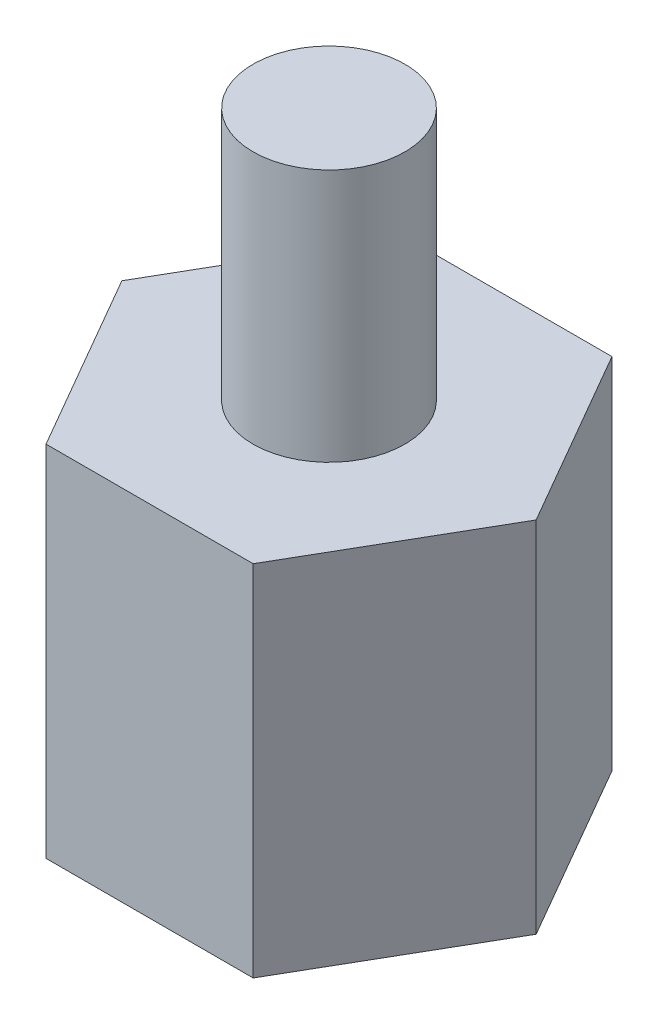
ISO-10303-21;
HEADER;
FILE_DESCRIPTION(('STEP AP214'),'2;1');
FILE_NAME('part.step','',(''),(''),'','','');
FILE_SCHEMA(('AUTOMOTIVE_DESIGN { 1 0 10303 214 1 1 1 1 }'));
ENDSEC;
DATA;
#1=APPLICATION_CONTEXT('core data for automotive mechanical design processes');
#2=APPLICATION_PROTOCOL_DEFINITION('international standard','automotive_design',2000,#1);
#3=PRODUCT_CONTEXT('',#1,'mechanical');
#4=PRODUCT('Part','Part','',(#3));
#5=PRODUCT_RELATED_PRODUCT_CATEGORY('part','',(#4));
#6=PRODUCT_DEFINITION_FORMATION('','',#4);
#7=PRODUCT_DEFINITION_CONTEXT('part definition',#1,'design');
#8=PRODUCT_DEFINITION('design','',#6,#7);
#9=PRODUCT_DEFINITION_SHAPE('','',#8);
#10=(LENGTH_UNIT() NAMED_UNIT(*) SI_UNIT(.MILLI.,.METRE.));
#11=(NAMED_UNIT(*) PLANE_ANGLE_UNIT() SI_UNIT($,.RADIAN.));
#12=(NAMED_UNIT(*) SI_UNIT($,.STERADIAN.) SOLID_ANGLE_UNIT());
#13=UNCERTAINTY_MEASURE_WITH_UNIT(LENGTH_MEASURE(1.E-05),#10,'distance_accuracy_value','');
#14=(GEOMETRIC_REPRESENTATION_CONTEXT(3) GLOBAL_UNCERTAINTY_ASSIGNED_CONTEXT((#13)) GLOBAL_UNIT_ASSIGNED_CONTEXT((#10,
#11,#12)) REPRESENTATION_CONTEXT('',''));
#15=CARTESIAN_POINT('',(0.,0.,0.));
#16=DIRECTION('',(0.,0.,1.));
#17=DIRECTION('',(1.,0.,0.));
#18=AXIS2_PLACEMENT_3D('',#15,#16,#17);
#19=CARTESIAN_POINT('',(3.63684481567929,6.2992,0.));
#20=DIRECTION('',(0.,1.,0.));
#21=DIRECTION('',(0.,0.,1.));
#22=AXIS2_PLACEMENT_3D('',#19,#20,#21);
#23=PLANE('',#22);
#24=DIRECTION('',(0.5,0.,-0.866025403784439));
#25=VECTOR('',#24,1.);
#26=CARTESIAN_POINT('',(1.81842240783965,6.2992,3.1496));
#27=LINE('',#26,#25);
#28=CARTESIAN_POINT('',(1.81842240783965,6.2992,3.1496));
#29=VERTEX_POINT('',#28);
#30=CARTESIAN_POINT('',(3.63684481567929,6.2992,0.));
#31=VERTEX_POINT('',#30);
#32=EDGE_CURVE('E129',#29,#31,#27,.T.);
#33=ORIENTED_EDGE('',*,*,#32,.T.);
#34=DIRECTION('',(-0.500000000000001,0.,-0.866025403784438));
#35=VECTOR('',#34,1.);
#36=CARTESIAN_POINT('',(3.63684481567929,6.2992,0.));
#37=LINE('',#36,#35);
#38=CARTESIAN_POINT('',(1.81842240783963,6.2992,-3.14960000000001));
#39=VERTEX_POINT('',#38);
#40=EDGE_CURVE('E87',#31,#39,#37,.T.);
#41=ORIENTED_EDGE('',*,*,#40,.T.);
#42=DIRECTION('',(-1.,0.,0.));
#43=VECTOR('',#42,1.);
#44=CARTESIAN_POINT('',(1.81842240783963,6.2992,-3.14960000000001));
#45=LINE('',#44,#43);
#46=CARTESIAN_POINT('',(-1.81842240783964,6.2992,-3.14960000000001));
#47=VERTEX_POINT('',#46);
#48=EDGE_CURVE('E100',#39,#47,#45,.T.);
#49=ORIENTED_EDGE('',*,*,#48,.T.);
#50=DIRECTION('',(-0.499999999999999,0.,0.866025403784439));
#51=VECTOR('',#50,1.);
#52=CARTESIAN_POINT('',(-1.81842240783964,6.2992,-3.14960000000001));
#53=LINE('',#52,#51);
#54=CARTESIAN_POINT('',(-3.63684481567929,6.2992,0.));
#55=VERTEX_POINT('',#54);
#56=EDGE_CURVE('E94',#47,#55,#53,.T.);
#57=ORIENTED_EDGE('',*,*,#56,.T.);
#58=DIRECTION('',(0.5,0.,0.866025403784439));
#59=VECTOR('',#58,1.);
#60=CARTESIAN_POINT('',(-3.63684481567929,6.2992,0.));
#61=LINE('',#60,#59);
#62=CARTESIAN_POINT('',(-1.81842240783965,6.2992,3.1496));
#63=VERTEX_POINT('',#62);
#64=EDGE_CURVE('E98',#55,#63,#61,.T.);
#65=ORIENTED_EDGE('',*,*,#64,.T.);
#66=DIRECTION('',(1.,0.,0.));
#67=VECTOR('',#66,1.);
#68=CARTESIAN_POINT('',(-1.81842240783965,6.2992,3.1496));
#69=LINE('',#68,#67);
#70=EDGE_CURVE('E50',#63,#29,#69,.T.);
#71=ORIENTED_EDGE('',*,*,#70,.T.);
#72=EDGE_LOOP('',(#33,#41,#49,#57,#65,#71));
#73=FACE_BOUND('',#72,.T.);
#74=CARTESIAN_POINT('',(0.,6.2992,0.));
#75=DIRECTION('',(0.,1.,0.));
#76=DIRECTION('',(0.,0.,1.));
#77=AXIS2_PLACEMENT_3D('',#74,#75,#76);
#78=CIRCLE('',#77,1.3335);
#79=CARTESIAN_POINT('',(0.,6.2992,1.3335));
#80=VERTEX_POINT('',#79);
#81=EDGE_CURVE('E180',#80,#80,#78,.T.);
#82=ORIENTED_EDGE('',*,*,#81,.F.);
#83=EDGE_LOOP('',(#82));
#84=FACE_BOUND('',#83,.T.);
#85=ADVANCED_FACE('F33',(#73,#84),#23,.T.);
#86=CARTESIAN_POINT('',(1.81842240783965,6.2992,3.1496));
#87=DIRECTION('',(-0.866025403784439,0.,-0.5));
#88=DIRECTION('',(-0.5,0.,0.866025403784439));
#89=AXIS2_PLACEMENT_3D('',#86,#87,#88);
#90=PLANE('',#89);
#91=DIRECTION('',(0.5,0.,-0.866025403784439));
#92=VECTOR('',#91,1.);
#93=CARTESIAN_POINT('',(1.81842240783965,0.,3.1496));
#94=LINE('',#93,#92);
#95=CARTESIAN_POINT('',(1.81842240783965,0.,3.1496));
#96=VERTEX_POINT('',#95);
#97=CARTESIAN_POINT('',(3.63684481567929,0.,0.));
#98=VERTEX_POINT('',#97);
#99=EDGE_CURVE('E118',#96,#98,#94,.T.);
#100=ORIENTED_EDGE('',*,*,#99,.T.);
#101=DIRECTION('',(0.,-1.,0.));
#102=VECTOR('',#101,1.);
#103=CARTESIAN_POINT('',(3.63684481567929,6.2992,0.));
#104=LINE('',#103,#102);
#105=EDGE_CURVE('E11',#31,#98,#104,.T.);
#106=ORIENTED_EDGE('',*,*,#105,.F.);
#107=ORIENTED_EDGE('',*,*,#32,.F.);
#108=DIRECTION('',(0.,-1.,0.));
#109=VECTOR('',#108,1.);
#110=CARTESIAN_POINT('',(1.81842240783965,6.2992,3.1496));
#111=LINE('',#110,#109);
#112=EDGE_CURVE('E114',#29,#96,#111,.T.);
#113=ORIENTED_EDGE('',*,*,#112,.T.);
#114=EDGE_LOOP('',(#100,#106,#107,#113));
#115=FACE_BOUND('',#114,.T.);
#116=ADVANCED_FACE('F35',(#115),#90,.F.);
#117=CARTESIAN_POINT('',(3.63684481567929,6.2992,0.));
#118=DIRECTION('',(-0.866025403784438,0.,0.500000000000001));
#119=DIRECTION('',(0.500000000000001,0.,0.866025403784438));
#120=AXIS2_PLACEMENT_3D('',#117,#118,#119);
#121=PLANE('',#120);
#122=DIRECTION('',(-0.500000000000001,0.,-0.866025403784438));
#123=VECTOR('',#122,1.);
#124=CARTESIAN_POINT('',(3.63684481567929,0.,0.));
#125=LINE('',#124,#123);
#126=CARTESIAN_POINT('',(1.81842240783963,0.,-3.14960000000001));
#127=VERTEX_POINT('',#126);
#128=EDGE_CURVE('E121',#98,#127,#125,.T.);
#129=ORIENTED_EDGE('',*,*,#128,.T.);
#130=DIRECTION('',(0.,-1.,0.));
#131=VECTOR('',#130,1.);
#132=CARTESIAN_POINT('',(1.81842240783963,6.2992,-3.14960000000001));
#133=LINE('',#132,#131);
#134=EDGE_CURVE('E42',#39,#127,#133,.T.);
#135=ORIENTED_EDGE('',*,*,#134,.F.);
#136=ORIENTED_EDGE('',*,*,#40,.F.);
#137=ORIENTED_EDGE('',*,*,#105,.T.);
#138=EDGE_LOOP('',(#129,#135,#136,#137));
#139=FACE_BOUND('',#138,.T.);
#140=ADVANCED_FACE('F159',(#139),#121,.F.);
#141=CARTESIAN_POINT('',(1.81842240783963,6.2992,-3.14960000000001));
#142=DIRECTION('',(0.,0.,1.));
#143=DIRECTION('',(1.,0.,0.));
#144=AXIS2_PLACEMENT_3D('',#141,#142,#143);
#145=PLANE('',#144);
#146=DIRECTION('',(-1.,0.,0.));
#147=VECTOR('',#146,1.);
#148=CARTESIAN_POINT('',(1.81842240783963,0.,-3.14960000000001));
#149=LINE('',#148,#147);
#150=CARTESIAN_POINT('',(-1.81842240783964,0.,-3.14960000000001));
#151=VERTEX_POINT('',#150);
#152=EDGE_CURVE('E124',#127,#151,#149,.T.);
#153=ORIENTED_EDGE('',*,*,#152,.T.);
#154=DIRECTION('',(0.,-1.,0.));
#155=VECTOR('',#154,1.);
#156=CARTESIAN_POINT('',(-1.81842240783964,6.2992,-3.14960000000001));
#157=LINE('',#156,#155);
#158=EDGE_CURVE('E109',#47,#151,#157,.T.);
#159=ORIENTED_EDGE('',*,*,#158,.F.);
#160=ORIENTED_EDGE('',*,*,#48,.F.);
#161=ORIENTED_EDGE('',*,*,#134,.T.);
#162=EDGE_LOOP('',(#153,#159,#160,#161));
#163=FACE_BOUND('',#162,.T.);
#164=ADVANCED_FACE('F135',(#163),#145,.F.);
#165=CARTESIAN_POINT('',(-1.81842240783964,6.2992,-3.14960000000001));
#166=DIRECTION('',(0.866025403784439,0.,0.499999999999999));
#167=DIRECTION('',(0.499999999999999,0.,-0.866025403784439));
#168=AXIS2_PLACEMENT_3D('',#165,#166,#167);
#169=PLANE('',#168);
#170=DIRECTION('',(-0.499999999999999,0.,0.866025403784439));
#171=VECTOR('',#170,1.);
#172=CARTESIAN_POINT('',(-1.81842240783964,0.,-3.14960000000001));
#173=LINE('',#172,#171);
#174=CARTESIAN_POINT('',(-3.63684481567929,0.,0.));
#175=VERTEX_POINT('',#174);
#176=EDGE_CURVE('E108',#151,#175,#173,.T.);
#177=ORIENTED_EDGE('',*,*,#176,.T.);
#178=DIRECTION('',(0.,-1.,0.));
#179=VECTOR('',#178,1.);
#180=CARTESIAN_POINT('',(-3.63684481567929,6.2992,0.));
#181=LINE('',#180,#179);
#182=EDGE_CURVE('E105',#55,#175,#181,.T.);
#183=ORIENTED_EDGE('',*,*,#182,.F.);
#184=ORIENTED_EDGE('',*,*,#56,.F.);
#185=ORIENTED_EDGE('',*,*,#158,.T.);
#186=EDGE_LOOP('',(#177,#183,#184,#185));
#187=FACE_BOUND('',#186,.T.);
#188=ADVANCED_FACE('F106',(#187),#169,.F.);
#189=CARTESIAN_POINT('',(-3.63684481567929,6.2992,0.));
#190=DIRECTION('',(0.866025403784439,0.,-0.5));
#191=DIRECTION('',(-0.5,0.,-0.866025403784439));
#192=AXIS2_PLACEMENT_3D('',#189,#190,#191);
#193=PLANE('',#192);
#194=DIRECTION('',(0.5,0.,0.866025403784439));
#195=VECTOR('',#194,1.);
#196=CARTESIAN_POINT('',(-3.63684481567929,0.,0.));
#197=LINE('',#196,#195);
#198=CARTESIAN_POINT('',(-1.81842240783965,0.,3.1496));
#199=VERTEX_POINT('',#198);
#200=EDGE_CURVE('E73',#175,#199,#197,.T.);
#201=ORIENTED_EDGE('',*,*,#200,.T.);
#202=DIRECTION('',(0.,-1.,0.));
#203=VECTOR('',#202,1.);
#204=CARTESIAN_POINT('',(-1.81842240783965,6.2992,3.1496));
#205=LINE('',#204,#203);
#206=EDGE_CURVE('E110',#63,#199,#205,.T.);
#207=ORIENTED_EDGE('',*,*,#206,.F.);
#208=ORIENTED_EDGE('',*,*,#64,.F.);
#209=ORIENTED_EDGE('',*,*,#182,.T.);
#210=EDGE_LOOP('',(#201,#207,#208,#209));
#211=FACE_BOUND('',#210,.T.);
#212=ADVANCED_FACE('F112',(#211),#193,.F.);
#213=CARTESIAN_POINT('',(-1.81842240783965,6.2992,3.1496));
#214=DIRECTION('',(0.,0.,-1.));
#215=DIRECTION('',(-1.,0.,0.));
#216=AXIS2_PLACEMENT_3D('',#213,#214,#215);
#217=PLANE('',#216);
#218=DIRECTION('',(1.,0.,0.));
#219=VECTOR('',#218,1.);
#220=CARTESIAN_POINT('',(-1.81842240783965,0.,3.1496));
#221=LINE('',#220,#219);
#222=EDGE_CURVE('E79',#199,#96,#221,.T.);
#223=ORIENTED_EDGE('',*,*,#222,.T.);
#224=ORIENTED_EDGE('',*,*,#112,.F.);
#225=ORIENTED_EDGE('',*,*,#70,.F.);
#226=ORIENTED_EDGE('',*,*,#206,.T.);
#227=EDGE_LOOP('',(#223,#224,#225,#226));
#228=FACE_BOUND('',#227,.T.);
#229=ADVANCED_FACE('F142',(#228),#217,.F.);
#230=CARTESIAN_POINT('',(3.63684481567929,0.,0.));
#231=DIRECTION('',(0.,1.,0.));
#232=DIRECTION('',(0.,0.,1.));
#233=AXIS2_PLACEMENT_3D('',#230,#231,#232);
#234=PLANE('',#233);
#235=CARTESIAN_POINT('',(0.,0.,0.));
#236=DIRECTION('',(0.,-1.,0.));
#237=DIRECTION('',(0.,0.,-1.));
#238=AXIS2_PLACEMENT_3D('',#235,#236,#237);
#239=CIRCLE('',#238,1.27);
#240=CARTESIAN_POINT('',(0.,0.,-1.27));
#241=VERTEX_POINT('',#240);
#242=EDGE_CURVE('E181',#241,#241,#239,.T.);
#243=ORIENTED_EDGE('',*,*,#242,.F.);
#244=EDGE_LOOP('',(#243));
#245=FACE_BOUND('',#244,.T.);
#246=ORIENTED_EDGE('',*,*,#99,.F.);
#247=ORIENTED_EDGE('',*,*,#222,.F.);
#248=ORIENTED_EDGE('',*,*,#200,.F.);
#249=ORIENTED_EDGE('',*,*,#176,.F.);
#250=ORIENTED_EDGE('',*,*,#152,.F.);
#251=ORIENTED_EDGE('',*,*,#128,.F.);
#252=EDGE_LOOP('',(#246,#247,#248,#249,#250,#251));
#253=FACE_BOUND('',#252,.T.);
#254=ADVANCED_FACE('F138',(#245,#253),#234,.F.);
#255=CARTESIAN_POINT('',(0.,10.7442,0.));
#256=DIRECTION('',(0.,-1.,0.));
#257=DIRECTION('',(0.,0.,-1.));
#258=AXIS2_PLACEMENT_3D('',#255,#256,#257);
#259=CYLINDRICAL_SURFACE('',#258,1.3335);
#260=CARTESIAN_POINT('',(0.,10.7442,0.));
#261=DIRECTION('',(0.,1.,0.));
#262=DIRECTION('',(0.,0.,1.));
#263=AXIS2_PLACEMENT_3D('',#260,#261,#262);
#264=CIRCLE('',#263,1.3335);
#265=CARTESIAN_POINT('',(0.,10.7442,1.3335));
#266=VERTEX_POINT('',#265);
#267=EDGE_CURVE('E122',#266,#266,#264,.T.);
#268=ORIENTED_EDGE('',*,*,#267,.F.);
#269=EDGE_LOOP('',(#268));
#270=FACE_BOUND('',#269,.T.);
#271=ORIENTED_EDGE('',*,*,#81,.T.);
#272=EDGE_LOOP('',(#271));
#273=FACE_BOUND('',#272,.T.);
#274=ADVANCED_FACE('F150',(#270,#273),#259,.T.);
#275=CARTESIAN_POINT('',(0.,10.7442,0.));
#276=DIRECTION('',(0.,1.,0.));
#277=DIRECTION('',(0.,0.,1.));
#278=AXIS2_PLACEMENT_3D('',#275,#276,#277);
#279=PLANE('',#278);
#280=ORIENTED_EDGE('',*,*,#267,.T.);
#281=EDGE_LOOP('',(#280));
#282=FACE_BOUND('',#281,.T.);
#283=ADVANCED_FACE('F163',(#282),#279,.T.);
#284=CARTESIAN_POINT('',(0.,3.81,0.));
#285=DIRECTION('',(0.,-1.,0.));
#286=DIRECTION('',(0.,0.,-1.));
#287=AXIS2_PLACEMENT_3D('',#284,#285,#286);
#288=CYLINDRICAL_SURFACE('',#287,1.27);
#289=CARTESIAN_POINT('',(0.,3.81,0.));
#290=DIRECTION('',(0.,-1.,0.));
#291=DIRECTION('',(0.,0.,-1.));
#292=AXIS2_PLACEMENT_3D('',#289,#290,#291);
#293=CIRCLE('',#292,1.27);
#294=CARTESIAN_POINT('',(0.,3.81,-1.27));
#295=VERTEX_POINT('',#294);
#296=EDGE_CURVE('E179',#295,#295,#293,.T.);
#297=CARTESIAN_POINT('',(0.,3.81,-1.27));
#298=CARTESIAN_POINT('',(0.,3.7703125,-1.27));
#299=CARTESIAN_POINT('',(0.,3.730625,-1.27));
#300=CARTESIAN_POINT('',(0.,3.65125,-1.27));
#301=CARTESIAN_POINT('',(0.,3.6115625,-1.27));
#302=CARTESIAN_POINT('',(0.,3.5321875,-1.27));
#303=CARTESIAN_POINT('',(0.,3.4925,-1.27));
#304=CARTESIAN_POINT('',(0.,3.413125,-1.27));
#305=CARTESIAN_POINT('',(0.,3.3734375,-1.27));
#306=CARTESIAN_POINT('',(0.,3.2940625,-1.27));
#307=CARTESIAN_POINT('',(0.,3.254375,-1.27));
#308=CARTESIAN_POINT('',(0.,3.175,-1.27));
#309=CARTESIAN_POINT('',(0.,3.1353125,-1.27));
#310=CARTESIAN_POINT('',(0.,3.0559375,-1.27));
#311=CARTESIAN_POINT('',(0.,3.01625,-1.27));
#312=CARTESIAN_POINT('',(0.,2.936875,-1.27));
#313=CARTESIAN_POINT('',(0.,2.8971875,-1.27));
#314=CARTESIAN_POINT('',(0.,2.8178125,-1.27));
#315=CARTESIAN_POINT('',(0.,2.778125,-1.27));
#316=CARTESIAN_POINT('',(0.,2.69875,-1.27));
#317=CARTESIAN_POINT('',(0.,2.6590625,-1.27));
#318=CARTESIAN_POINT('',(0.,2.5796875,-1.27));
#319=CARTESIAN_POINT('',(0.,2.54,-1.27));
#320=CARTESIAN_POINT('',(0.,2.460625,-1.27));
#321=CARTESIAN_POINT('',(0.,2.4209375,-1.27));
#322=CARTESIAN_POINT('',(0.,2.3415625,-1.27));
#323=CARTESIAN_POINT('',(0.,2.301875,-1.27));
#324=CARTESIAN_POINT('',(0.,2.2225,-1.27));
#325=CARTESIAN_POINT('',(0.,2.1828125,-1.27));
#326=CARTESIAN_POINT('',(0.,2.1034375,-1.27));
#327=CARTESIAN_POINT('',(0.,2.06375,-1.27));
#328=CARTESIAN_POINT('',(0.,1.984375,-1.27));
#329=CARTESIAN_POINT('',(0.,1.9446875,-1.27));
#330=CARTESIAN_POINT('',(0.,1.8653125,-1.27));
#331=CARTESIAN_POINT('',(0.,1.825625,-1.27));
#332=CARTESIAN_POINT('',(0.,1.74625,-1.27));
#333=CARTESIAN_POINT('',(0.,1.7065625,-1.27));
#334=CARTESIAN_POINT('',(0.,1.6271875,-1.27));
#335=CARTESIAN_POINT('',(0.,1.5875,-1.27));
#336=CARTESIAN_POINT('',(0.,1.508125,-1.27));
#337=CARTESIAN_POINT('',(0.,1.4684375,-1.27));
#338=CARTESIAN_POINT('',(0.,1.3890625,-1.27));
#339=CARTESIAN_POINT('',(0.,1.349375,-1.27));
#340=CARTESIAN_POINT('',(0.,1.27,-1.27));
#341=CARTESIAN_POINT('',(0.,1.2303125,-1.27));
#342=CARTESIAN_POINT('',(0.,1.1509375,-1.27));
#343=CARTESIAN_POINT('',(0.,1.11125,-1.27));
#344=CARTESIAN_POINT('',(0.,1.031875,-1.27));
#345=CARTESIAN_POINT('',(0.,0.9921875,-1.27));
#346=CARTESIAN_POINT('',(0.,0.9128125,-1.27));
#347=CARTESIAN_POINT('',(0.,0.873125,-1.27));
#348=CARTESIAN_POINT('',(0.,0.79375,-1.27));
#349=CARTESIAN_POINT('',(0.,0.7540625,-1.27));
#350=CARTESIAN_POINT('',(0.,0.6746875,-1.27));
#351=CARTESIAN_POINT('',(0.,0.635,-1.27));
#352=CARTESIAN_POINT('',(0.,0.555625,-1.27));
#353=CARTESIAN_POINT('',(0.,0.5159375,-1.27));
#354=CARTESIAN_POINT('',(0.,0.4365625,-1.27));
#355=CARTESIAN_POINT('',(0.,0.396875,-1.27));
#356=CARTESIAN_POINT('',(0.,0.3175,-1.27));
#357=CARTESIAN_POINT('',(0.,0.2778125,-1.27));
#358=CARTESIAN_POINT('',(0.,0.1984375,-1.27));
#359=CARTESIAN_POINT('',(0.,0.15875,-1.27));
#360=CARTESIAN_POINT('',(0.,0.0793749999999999,-1.27));
#361=CARTESIAN_POINT('',(0.,0.0396874999999999,-1.27));
#362=CARTESIAN_POINT('',(0.,0.,-1.27));
#363=B_SPLINE_CURVE_WITH_KNOTS('',3,(#297,#298,#299,#300,#301,#302,#303,#304,#305,#306,#307,
#308,#309,#310,#311,#312,#313,#314,#315,#316,#317,#318,#319,#320,#321,#322,#323,#324,#325,#326,
#327,#328,#329,#330,#331,#332,#333,#334,#335,#336,#337,#338,#339,#340,#341,#342,#343,#344,#345,
#346,#347,#348,#349,#350,#351,#352,#353,#354,#355,#356,#357,#358,#359,#360,#361,#362),
.UNSPECIFIED.,.F.,.F.,(4,2,2,2,2,2,2,2,2,2,2,2,2,2,2,2,2,2,2,2,2,2,2,2,2,2,2,2,2,2,2,2,4),(0.,
0.1190625,0.238125,0.3571875,0.47625,0.5953125,0.714375,0.8334375,0.9525,1.0715625,1.190625,
1.3096875,1.42875,1.5478125,1.666875,1.7859375,1.905,2.0240625,2.143125,2.2621875,2.38125,
2.5003125,2.619375,2.7384375,2.8575,2.9765625,3.095625,3.2146875,3.33375,3.4528125,3.571875,
3.6909375,3.81),.UNSPECIFIED.);
#364=EDGE_CURVE('BSEAM167',#295,#241,#363,.T.);
#365=ORIENTED_EDGE('',*,*,#296,.F.);
#366=ORIENTED_EDGE('',*,*,#242,.T.);
#367=ORIENTED_EDGE('',*,*,#364,.T.);
#368=ORIENTED_EDGE('',*,*,#364,.F.);
#369=EDGE_LOOP('',(#365,#367,#366,#368));
#370=FACE_BOUND('',#369,.T.);
#371=ADVANCED_FACE('F167',(#370),#288,.F.);
#372=CARTESIAN_POINT('',(0.,3.81,0.));
#373=DIRECTION('',(0.,-1.,0.));
#374=DIRECTION('',(0.,0.,-1.));
#375=AXIS2_PLACEMENT_3D('',#372,#373,#374);
#376=PLANE('',#375);
#377=ORIENTED_EDGE('',*,*,#296,.T.);
#378=EDGE_LOOP('',(#377));
#379=FACE_BOUND('',#378,.T.);
#380=ADVANCED_FACE('F171',(#379),#376,.T.);
#381=CLOSED_SHELL('',(#85,#116,#140,#164,#188,#212,#229,#254,#274,#283,#371,#380));
#382=MANIFOLD_SOLID_BREP('B2',#381);
#383=ADVANCED_BREP_SHAPE_REPRESENTATION('',(#18,#382),#14);
#384=SHAPE_DEFINITION_REPRESENTATION(#9,#383);
ENDSEC;
END-ISO-10303-21;
